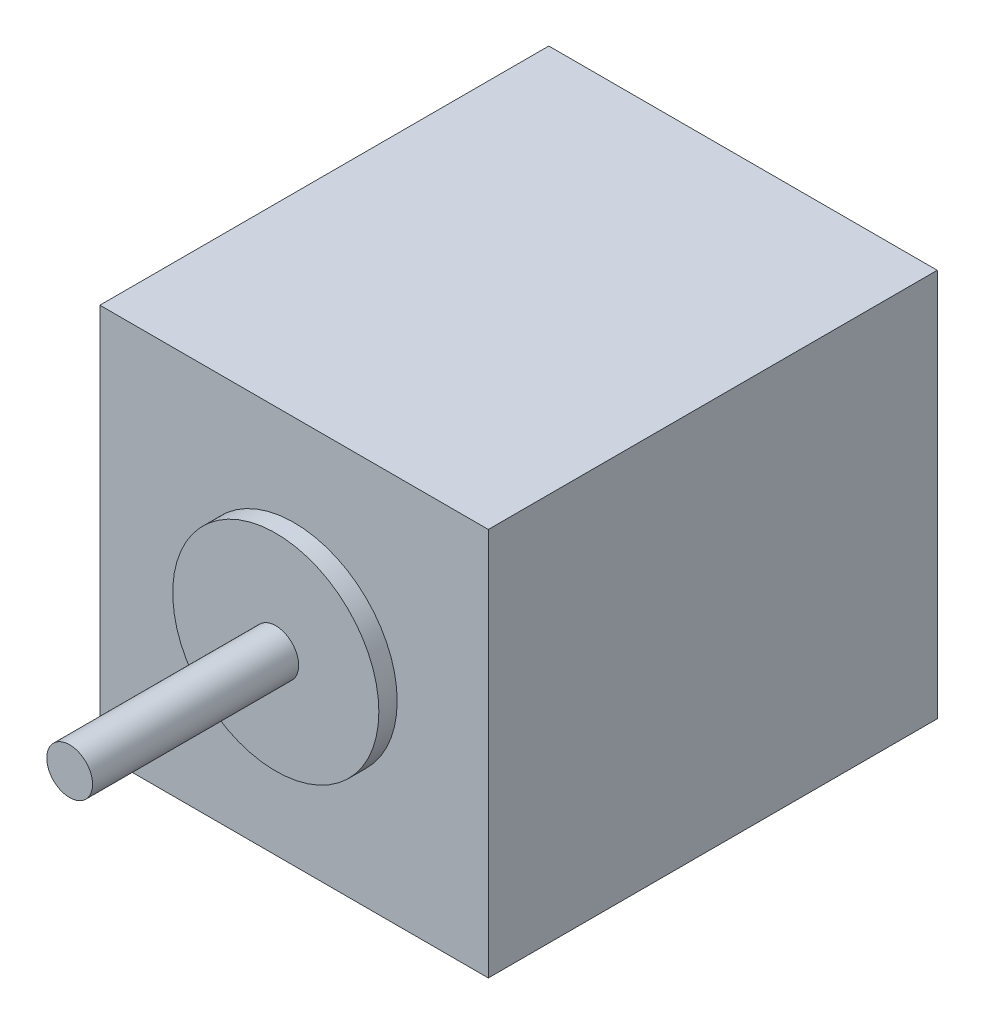
ISO-10303-21;
HEADER;
FILE_DESCRIPTION(('STEP AP214'),'2;1');
FILE_NAME('part.step','',(''),(''),'','','');
FILE_SCHEMA(('AUTOMOTIVE_DESIGN { 1 0 10303 214 1 1 1 1 }'));
ENDSEC;
DATA;
#1=APPLICATION_CONTEXT('core data for automotive mechanical design processes');
#2=APPLICATION_PROTOCOL_DEFINITION('international standard','automotive_design',2000,#1);
#3=PRODUCT_CONTEXT('',#1,'mechanical');
#4=PRODUCT('Part','Part','',(#3));
#5=PRODUCT_RELATED_PRODUCT_CATEGORY('part','',(#4));
#6=PRODUCT_DEFINITION_FORMATION('','',#4);
#7=PRODUCT_DEFINITION_CONTEXT('part definition',#1,'design');
#8=PRODUCT_DEFINITION('design','',#6,#7);
#9=PRODUCT_DEFINITION_SHAPE('','',#8);
#10=(LENGTH_UNIT() NAMED_UNIT(*) SI_UNIT(.MILLI.,.METRE.));
#11=(NAMED_UNIT(*) PLANE_ANGLE_UNIT() SI_UNIT($,.RADIAN.));
#12=(NAMED_UNIT(*) SI_UNIT($,.STERADIAN.) SOLID_ANGLE_UNIT());
#13=UNCERTAINTY_MEASURE_WITH_UNIT(LENGTH_MEASURE(1.E-05),#10,'distance_accuracy_value','');
#14=(GEOMETRIC_REPRESENTATION_CONTEXT(3) GLOBAL_UNCERTAINTY_ASSIGNED_CONTEXT((#13)) GLOBAL_UNIT_ASSIGNED_CONTEXT((#10,
#11,#12)) REPRESENTATION_CONTEXT('',''));
#15=CARTESIAN_POINT('',(0.,0.,0.));
#16=DIRECTION('',(0.,0.,1.));
#17=DIRECTION('',(1.,0.,0.));
#18=AXIS2_PLACEMENT_3D('',#15,#16,#17);
#19=CARTESIAN_POINT('',(-4.19583333333336,4.30625000000001,51.));
#20=DIRECTION('',(0.,0.,1.));
#21=DIRECTION('',(1.,0.,0.));
#22=AXIS2_PLACEMENT_3D('',#19,#20,#21);
#23=PLANE('',#22);
#24=CARTESIAN_POINT('',(-4.19583333333336,4.30625000000001,51.));
#25=DIRECTION('',(0.,0.,1.));
#26=DIRECTION('',(1.,0.,0.));
#27=AXIS2_PLACEMENT_3D('',#24,#25,#26);
#28=CIRCLE('',#27,11.25);
#29=CARTESIAN_POINT('',(7.05416666666664,4.30625000000001,51.));
#30=VERTEX_POINT('',#29);
#31=EDGE_CURVE('E101',#30,#30,#28,.T.);
#32=ORIENTED_EDGE('',*,*,#31,.T.);
#33=EDGE_LOOP('',(#32));
#34=FACE_BOUND('',#33,.T.);
#35=CARTESIAN_POINT('',(-4.19583333333336,4.30625000000001,51.));
#36=DIRECTION('',(0.,0.,1.));
#37=DIRECTION('',(1.,0.,0.));
#38=AXIS2_PLACEMENT_3D('',#35,#36,#37);
#39=CIRCLE('',#38,2.5);
#40=CARTESIAN_POINT('',(-6.69583333333336,4.30625000000001,51.));
#41=VERTEX_POINT('',#40);
#42=EDGE_CURVE('E118',#41,#41,#39,.T.);
#43=ORIENTED_EDGE('',*,*,#42,.F.);
#44=EDGE_LOOP('',(#43));
#45=FACE_BOUND('',#44,.T.);
#46=ADVANCED_FACE('F33',(#34,#45),#23,.T.);
#47=CARTESIAN_POINT('',(0.,0.,49.));
#48=DIRECTION('',(0.,0.,1.));
#49=DIRECTION('',(1.,0.,0.));
#50=AXIS2_PLACEMENT_3D('',#47,#48,#49);
#51=PLANE('',#50);
#52=DIRECTION('',(0.,-1.,0.));
#53=VECTOR('',#52,1.);
#54=CARTESIAN_POINT('',(-25.3958333333334,25.50625,49.));
#55=LINE('',#54,#53);
#56=CARTESIAN_POINT('',(-25.3958333333334,25.50625,49.));
#57=VERTEX_POINT('',#56);
#58=CARTESIAN_POINT('',(-25.3958333333334,-16.89375,49.));
#59=VERTEX_POINT('',#58);
#60=EDGE_CURVE('E86',#57,#59,#55,.T.);
#61=ORIENTED_EDGE('',*,*,#60,.T.);
#62=DIRECTION('',(1.,0.,0.));
#63=VECTOR('',#62,1.);
#64=CARTESIAN_POINT('',(-25.3958333333334,-16.89375,49.));
#65=LINE('',#64,#63);
#66=CARTESIAN_POINT('',(17.0041666666666,-16.89375,49.));
#67=VERTEX_POINT('',#66);
#68=EDGE_CURVE('E80',#59,#67,#65,.T.);
#69=ORIENTED_EDGE('',*,*,#68,.T.);
#70=DIRECTION('',(0.,1.,0.));
#71=VECTOR('',#70,1.);
#72=CARTESIAN_POINT('',(17.0041666666666,25.50625,49.));
#73=LINE('',#72,#71);
#74=CARTESIAN_POINT('',(17.0041666666666,25.50625,49.));
#75=VERTEX_POINT('',#74);
#76=EDGE_CURVE('E84',#67,#75,#73,.T.);
#77=ORIENTED_EDGE('',*,*,#76,.T.);
#78=DIRECTION('',(-1.,0.,0.));
#79=VECTOR('',#78,1.);
#80=CARTESIAN_POINT('',(-25.3958333333334,25.50625,49.));
#81=LINE('',#80,#79);
#82=EDGE_CURVE('E50',#75,#57,#81,.T.);
#83=ORIENTED_EDGE('',*,*,#82,.T.);
#84=EDGE_LOOP('',(#61,#69,#77,#83));
#85=FACE_BOUND('',#84,.T.);
#86=CARTESIAN_POINT('',(-4.19583333333336,4.30625000000001,49.));
#87=DIRECTION('',(0.,0.,1.));
#88=DIRECTION('',(1.,0.,0.));
#89=AXIS2_PLACEMENT_3D('',#86,#87,#88);
#90=CIRCLE('',#89,11.25);
#91=CARTESIAN_POINT('',(7.05416666666664,4.30625000000001,49.));
#92=VERTEX_POINT('',#91);
#93=EDGE_CURVE('E112',#92,#92,#90,.T.);
#94=ORIENTED_EDGE('',*,*,#93,.F.);
#95=EDGE_LOOP('',(#94));
#96=FACE_BOUND('',#95,.T.);
#97=ADVANCED_FACE('F81',(#85,#96),#51,.T.);
#98=CARTESIAN_POINT('',(-25.3958333333334,25.50625,49.));
#99=DIRECTION('',(1.,0.,0.));
#100=DIRECTION('',(0.,0.,-1.));
#101=AXIS2_PLACEMENT_3D('',#98,#99,#100);
#102=PLANE('',#101);
#103=DIRECTION('',(0.,-1.,0.));
#104=VECTOR('',#103,1.);
#105=CARTESIAN_POINT('',(-25.3958333333334,25.50625,0.));
#106=LINE('',#105,#104);
#107=CARTESIAN_POINT('',(-25.3958333333334,25.50625,0.));
#108=VERTEX_POINT('',#107);
#109=CARTESIAN_POINT('',(-25.3958333333334,-16.89375,0.));
#110=VERTEX_POINT('',#109);
#111=EDGE_CURVE('E98',#108,#110,#106,.T.);
#112=ORIENTED_EDGE('',*,*,#111,.T.);
#113=DIRECTION('',(0.,0.,-1.));
#114=VECTOR('',#113,1.);
#115=CARTESIAN_POINT('',(-25.3958333333334,-16.89375,49.));
#116=LINE('',#115,#114);
#117=EDGE_CURVE('E11',#59,#110,#116,.T.);
#118=ORIENTED_EDGE('',*,*,#117,.F.);
#119=ORIENTED_EDGE('',*,*,#60,.F.);
#120=DIRECTION('',(0.,0.,-1.));
#121=VECTOR('',#120,1.);
#122=CARTESIAN_POINT('',(-25.3958333333334,25.50625,49.));
#123=LINE('',#122,#121);
#124=EDGE_CURVE('E94',#57,#108,#123,.T.);
#125=ORIENTED_EDGE('',*,*,#124,.T.);
#126=EDGE_LOOP('',(#112,#118,#119,#125));
#127=FACE_BOUND('',#126,.T.);
#128=ADVANCED_FACE('F35',(#127),#102,.F.);
#129=CARTESIAN_POINT('',(-25.3958333333334,-16.89375,49.));
#130=DIRECTION('',(0.,1.,0.));
#131=DIRECTION('',(-1.,0.,0.));
#132=AXIS2_PLACEMENT_3D('',#129,#130,#131);
#133=PLANE('',#132);
#134=DIRECTION('',(1.,0.,0.));
#135=VECTOR('',#134,1.);
#136=CARTESIAN_POINT('',(-25.3958333333334,-16.89375,0.));
#137=LINE('',#136,#135);
#138=CARTESIAN_POINT('',(17.0041666666666,-16.89375,0.));
#139=VERTEX_POINT('',#138);
#140=EDGE_CURVE('E90',#110,#139,#137,.T.);
#141=ORIENTED_EDGE('',*,*,#140,.T.);
#142=DIRECTION('',(0.,0.,-1.));
#143=VECTOR('',#142,1.);
#144=CARTESIAN_POINT('',(17.0041666666666,-16.89375,49.));
#145=LINE('',#144,#143);
#146=EDGE_CURVE('E42',#67,#139,#145,.T.);
#147=ORIENTED_EDGE('',*,*,#146,.F.);
#148=ORIENTED_EDGE('',*,*,#68,.F.);
#149=ORIENTED_EDGE('',*,*,#117,.T.);
#150=EDGE_LOOP('',(#141,#147,#148,#149));
#151=FACE_BOUND('',#150,.T.);
#152=ADVANCED_FACE('F89',(#151),#133,.F.);
#153=CARTESIAN_POINT('',(17.0041666666666,25.50625,49.));
#154=DIRECTION('',(-1.,0.,0.));
#155=DIRECTION('',(0.,-1.,0.));
#156=AXIS2_PLACEMENT_3D('',#153,#154,#155);
#157=PLANE('',#156);
#158=DIRECTION('',(0.,1.,0.));
#159=VECTOR('',#158,1.);
#160=CARTESIAN_POINT('',(17.0041666666666,25.50625,0.));
#161=LINE('',#160,#159);
#162=CARTESIAN_POINT('',(17.0041666666666,25.50625,0.));
#163=VERTEX_POINT('',#162);
#164=EDGE_CURVE('E67',#139,#163,#161,.T.);
#165=ORIENTED_EDGE('',*,*,#164,.T.);
#166=DIRECTION('',(0.,0.,-1.));
#167=VECTOR('',#166,1.);
#168=CARTESIAN_POINT('',(17.0041666666666,25.50625,49.));
#169=LINE('',#168,#167);
#170=EDGE_CURVE('E91',#75,#163,#169,.T.);
#171=ORIENTED_EDGE('',*,*,#170,.F.);
#172=ORIENTED_EDGE('',*,*,#76,.F.);
#173=ORIENTED_EDGE('',*,*,#146,.T.);
#174=EDGE_LOOP('',(#165,#171,#172,#173));
#175=FACE_BOUND('',#174,.T.);
#176=ADVANCED_FACE('F92',(#175),#157,.F.);
#177=CARTESIAN_POINT('',(-25.3958333333334,25.50625,49.));
#178=DIRECTION('',(0.,-1.,0.));
#179=DIRECTION('',(0.,0.,-1.));
#180=AXIS2_PLACEMENT_3D('',#177,#178,#179);
#181=PLANE('',#180);
#182=DIRECTION('',(-1.,0.,0.));
#183=VECTOR('',#182,1.);
#184=CARTESIAN_POINT('',(-25.3958333333334,25.50625,0.));
#185=LINE('',#184,#183);
#186=EDGE_CURVE('E73',#163,#108,#185,.T.);
#187=ORIENTED_EDGE('',*,*,#186,.T.);
#188=ORIENTED_EDGE('',*,*,#124,.F.);
#189=ORIENTED_EDGE('',*,*,#82,.F.);
#190=ORIENTED_EDGE('',*,*,#170,.T.);
#191=EDGE_LOOP('',(#187,#188,#189,#190));
#192=FACE_BOUND('',#191,.T.);
#193=ADVANCED_FACE('F106',(#192),#181,.F.);
#194=CARTESIAN_POINT('',(0.,0.,0.));
#195=DIRECTION('',(0.,0.,1.));
#196=DIRECTION('',(1.,0.,0.));
#197=AXIS2_PLACEMENT_3D('',#194,#195,#196);
#198=PLANE('',#197);
#199=ORIENTED_EDGE('',*,*,#111,.F.);
#200=ORIENTED_EDGE('',*,*,#186,.F.);
#201=ORIENTED_EDGE('',*,*,#164,.F.);
#202=ORIENTED_EDGE('',*,*,#140,.F.);
#203=EDGE_LOOP('',(#199,#200,#201,#202));
#204=FACE_BOUND('',#203,.T.);
#205=ADVANCED_FACE('F109',(#204),#198,.F.);
#206=CARTESIAN_POINT('',(-4.19583333333336,4.30625000000001,51.));
#207=DIRECTION('',(0.,0.,-1.));
#208=DIRECTION('',(-1.,0.,0.));
#209=AXIS2_PLACEMENT_3D('',#206,#207,#208);
#210=CYLINDRICAL_SURFACE('',#209,11.25);
#211=ORIENTED_EDGE('',*,*,#31,.F.);
#212=EDGE_LOOP('',(#211));
#213=FACE_BOUND('',#212,.T.);
#214=ORIENTED_EDGE('',*,*,#93,.T.);
#215=EDGE_LOOP('',(#214));
#216=FACE_BOUND('',#215,.T.);
#217=ADVANCED_FACE('F129',(#213,#216),#210,.T.);
#218=CARTESIAN_POINT('',(-4.19583333333336,4.30625000000001,73.5));
#219=DIRECTION('',(0.,0.,-1.));
#220=DIRECTION('',(-1.,0.,0.));
#221=AXIS2_PLACEMENT_3D('',#218,#219,#220);
#222=CYLINDRICAL_SURFACE('',#221,2.5);
#223=CARTESIAN_POINT('',(-4.19583333333336,4.30625000000001,73.5));
#224=DIRECTION('',(0.,0.,1.));
#225=DIRECTION('',(1.,0.,0.));
#226=AXIS2_PLACEMENT_3D('',#223,#224,#225);
#227=CIRCLE('',#226,2.5);
#228=CARTESIAN_POINT('',(-6.69583333333336,4.30625000000001,73.5));
#229=VERTEX_POINT('',#228);
#230=EDGE_CURVE('E115',#229,#229,#227,.T.);
#231=CARTESIAN_POINT('',(-6.69583333333336,4.30625000000001,73.5));
#232=CARTESIAN_POINT('',(-6.69583333333336,4.30625000000001,73.265625));
#233=CARTESIAN_POINT('',(-6.69583333333336,4.30625000000001,73.03125));
#234=CARTESIAN_POINT('',(-6.69583333333336,4.30625000000001,72.5625));
#235=CARTESIAN_POINT('',(-6.69583333333336,4.30625000000001,72.328125));
#236=CARTESIAN_POINT('',(-6.69583333333336,4.30625000000001,71.859375));
#237=CARTESIAN_POINT('',(-6.69583333333336,4.30625000000001,71.625));
#238=CARTESIAN_POINT('',(-6.69583333333336,4.30625000000001,71.15625));
#239=CARTESIAN_POINT('',(-6.69583333333336,4.30625000000001,70.921875));
#240=CARTESIAN_POINT('',(-6.69583333333336,4.30625000000001,70.453125));
#241=CARTESIAN_POINT('',(-6.69583333333336,4.30625000000001,70.21875));
#242=CARTESIAN_POINT('',(-6.69583333333336,4.30625000000001,69.75));
#243=CARTESIAN_POINT('',(-6.69583333333336,4.30625000000001,69.515625));
#244=CARTESIAN_POINT('',(-6.69583333333336,4.30625000000001,69.046875));
#245=CARTESIAN_POINT('',(-6.69583333333336,4.30625000000001,68.8125));
#246=CARTESIAN_POINT('',(-6.69583333333336,4.30625000000001,68.34375));
#247=CARTESIAN_POINT('',(-6.69583333333336,4.30625000000001,68.109375));
#248=CARTESIAN_POINT('',(-6.69583333333336,4.30625000000001,67.640625));
#249=CARTESIAN_POINT('',(-6.69583333333336,4.30625000000001,67.40625));
#250=CARTESIAN_POINT('',(-6.69583333333336,4.30625000000001,66.9375));
#251=CARTESIAN_POINT('',(-6.69583333333336,4.30625000000001,66.703125));
#252=CARTESIAN_POINT('',(-6.69583333333336,4.30625000000001,66.234375));
#253=CARTESIAN_POINT('',(-6.69583333333336,4.30625000000001,66.));
#254=CARTESIAN_POINT('',(-6.69583333333336,4.30625000000001,65.53125));
#255=CARTESIAN_POINT('',(-6.69583333333336,4.30625000000001,65.296875));
#256=CARTESIAN_POINT('',(-6.69583333333336,4.30625000000001,64.828125));
#257=CARTESIAN_POINT('',(-6.69583333333336,4.30625000000001,64.59375));
#258=CARTESIAN_POINT('',(-6.69583333333336,4.30625000000001,64.125));
#259=CARTESIAN_POINT('',(-6.69583333333336,4.30625000000001,63.890625));
#260=CARTESIAN_POINT('',(-6.69583333333336,4.30625000000001,63.421875));
#261=CARTESIAN_POINT('',(-6.69583333333336,4.30625000000001,63.1875));
#262=CARTESIAN_POINT('',(-6.69583333333336,4.30625000000001,62.71875));
#263=CARTESIAN_POINT('',(-6.69583333333336,4.30625000000001,62.484375));
#264=CARTESIAN_POINT('',(-6.69583333333336,4.30625000000001,62.015625));
#265=CARTESIAN_POINT('',(-6.69583333333336,4.30625000000001,61.78125));
#266=CARTESIAN_POINT('',(-6.69583333333336,4.30625000000001,61.3125));
#267=CARTESIAN_POINT('',(-6.69583333333336,4.30625000000001,61.078125));
#268=CARTESIAN_POINT('',(-6.69583333333336,4.30625000000001,60.609375));
#269=CARTESIAN_POINT('',(-6.69583333333336,4.30625000000001,60.375));
#270=CARTESIAN_POINT('',(-6.69583333333336,4.30625000000001,59.90625));
#271=CARTESIAN_POINT('',(-6.69583333333336,4.30625000000001,59.671875));
#272=CARTESIAN_POINT('',(-6.69583333333336,4.30625000000001,59.203125));
#273=CARTESIAN_POINT('',(-6.69583333333336,4.30625000000001,58.96875));
#274=CARTESIAN_POINT('',(-6.69583333333336,4.30625000000001,58.5));
#275=CARTESIAN_POINT('',(-6.69583333333336,4.30625000000001,58.265625));
#276=CARTESIAN_POINT('',(-6.69583333333336,4.30625000000001,57.796875));
#277=CARTESIAN_POINT('',(-6.69583333333336,4.30625000000001,57.5625));
#278=CARTESIAN_POINT('',(-6.69583333333336,4.30625000000001,57.09375));
#279=CARTESIAN_POINT('',(-6.69583333333336,4.30625000000001,56.859375));
#280=CARTESIAN_POINT('',(-6.69583333333336,4.30625000000001,56.390625));
#281=CARTESIAN_POINT('',(-6.69583333333336,4.30625000000001,56.15625));
#282=CARTESIAN_POINT('',(-6.69583333333336,4.30625000000001,55.6875));
#283=CARTESIAN_POINT('',(-6.69583333333336,4.30625000000001,55.453125));
#284=CARTESIAN_POINT('',(-6.69583333333336,4.30625000000001,54.984375));
#285=CARTESIAN_POINT('',(-6.69583333333336,4.30625000000001,54.75));
#286=CARTESIAN_POINT('',(-6.69583333333336,4.30625000000001,54.28125));
#287=CARTESIAN_POINT('',(-6.69583333333336,4.30625000000001,54.046875));
#288=CARTESIAN_POINT('',(-6.69583333333336,4.30625000000001,53.578125));
#289=CARTESIAN_POINT('',(-6.69583333333336,4.30625000000001,53.34375));
#290=CARTESIAN_POINT('',(-6.69583333333336,4.30625000000001,52.875));
#291=CARTESIAN_POINT('',(-6.69583333333336,4.30625000000001,52.640625));
#292=CARTESIAN_POINT('',(-6.69583333333336,4.30625000000001,52.171875));
#293=CARTESIAN_POINT('',(-6.69583333333336,4.30625000000001,51.9375));
#294=CARTESIAN_POINT('',(-6.69583333333336,4.30625000000001,51.46875));
#295=CARTESIAN_POINT('',(-6.69583333333336,4.30625000000001,51.234375));
#296=CARTESIAN_POINT('',(-6.69583333333336,4.30625000000001,51.));
#297=B_SPLINE_CURVE_WITH_KNOTS('',3,(#231,#232,#233,#234,#235,#236,#237,#238,#239,#240,#241,
#242,#243,#244,#245,#246,#247,#248,#249,#250,#251,#252,#253,#254,#255,#256,#257,#258,#259,#260,
#261,#262,#263,#264,#265,#266,#267,#268,#269,#270,#271,#272,#273,#274,#275,#276,#277,#278,#279,
#280,#281,#282,#283,#284,#285,#286,#287,#288,#289,#290,#291,#292,#293,#294,#295,#296),
.UNSPECIFIED.,.F.,.F.,(4,2,2,2,2,2,2,2,2,2,2,2,2,2,2,2,2,2,2,2,2,2,2,2,2,2,2,2,2,2,2,2,4),(0.,
0.703125000000013,1.40625000000001,2.10937500000001,2.81250000000001,3.51562500000001,
4.21875000000001,4.92187500000001,5.62500000000001,6.328125,7.03125,7.734375,8.43750000000001,
9.14062500000001,9.84375000000001,10.546875,11.25,11.953125,12.65625,13.359375,14.0625,
14.765625,15.46875,16.171875,16.875,17.578125,18.28125,18.984375,19.6875,20.390625,21.09375,
21.796875,22.5),.UNSPECIFIED.);
#298=EDGE_CURVE('BSEAM126',#229,#41,#297,.T.);
#299=ORIENTED_EDGE('',*,*,#230,.F.);
#300=ORIENTED_EDGE('',*,*,#42,.T.);
#301=ORIENTED_EDGE('',*,*,#298,.T.);
#302=ORIENTED_EDGE('',*,*,#298,.F.);
#303=EDGE_LOOP('',(#299,#301,#300,#302));
#304=FACE_BOUND('',#303,.T.);
#305=ADVANCED_FACE('F126',(#304),#222,.T.);
#306=CARTESIAN_POINT('',(-4.19583333333336,4.30625000000001,73.5));
#307=DIRECTION('',(0.,0.,1.));
#308=DIRECTION('',(1.,0.,0.));
#309=AXIS2_PLACEMENT_3D('',#306,#307,#308);
#310=PLANE('',#309);
#311=ORIENTED_EDGE('',*,*,#230,.T.);
#312=EDGE_LOOP('',(#311));
#313=FACE_BOUND('',#312,.T.);
#314=ADVANCED_FACE('F124',(#313),#310,.T.);
#315=CLOSED_SHELL('',(#46,#97,#128,#152,#176,#193,#205,#217,#305,#314));
#316=MANIFOLD_SOLID_BREP('B2',#315);
#317=ADVANCED_BREP_SHAPE_REPRESENTATION('',(#18,#316),#14);
#318=SHAPE_DEFINITION_REPRESENTATION(#9,#317);
ENDSEC;
END-ISO-10303-21;
